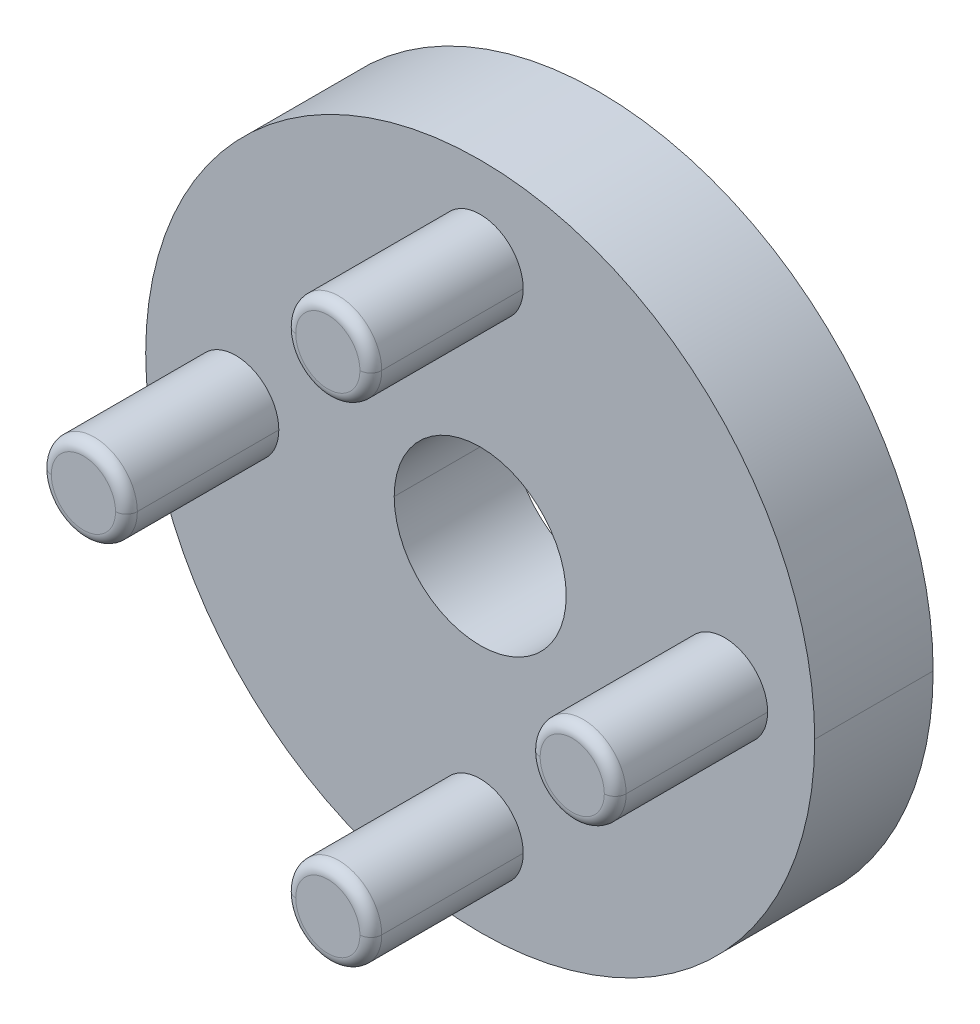
ISO-10303-21;
HEADER;
FILE_DESCRIPTION(('STEP AP214'),'2;1');
FILE_NAME('part.step','',(''),(''),'','','');
FILE_SCHEMA(('AUTOMOTIVE_DESIGN { 1 0 10303 214 1 1 1 1 }'));
ENDSEC;
DATA;
#1=APPLICATION_CONTEXT('core data for automotive mechanical design processes');
#2=APPLICATION_PROTOCOL_DEFINITION('international standard','automotive_design',2000,#1);
#3=PRODUCT_CONTEXT('',#1,'mechanical');
#4=PRODUCT('Part','Part','',(#3));
#5=PRODUCT_RELATED_PRODUCT_CATEGORY('part','',(#4));
#6=PRODUCT_DEFINITION_FORMATION('','',#4);
#7=PRODUCT_DEFINITION_CONTEXT('part definition',#1,'design');
#8=PRODUCT_DEFINITION('design','',#6,#7);
#9=PRODUCT_DEFINITION_SHAPE('','',#8);
#10=(LENGTH_UNIT() NAMED_UNIT(*) SI_UNIT(.MILLI.,.METRE.));
#11=(NAMED_UNIT(*) PLANE_ANGLE_UNIT() SI_UNIT($,.RADIAN.));
#12=(NAMED_UNIT(*) SI_UNIT($,.STERADIAN.) SOLID_ANGLE_UNIT());
#13=UNCERTAINTY_MEASURE_WITH_UNIT(LENGTH_MEASURE(1.E-05),#10,'distance_accuracy_value','');
#14=(GEOMETRIC_REPRESENTATION_CONTEXT(3) GLOBAL_UNCERTAINTY_ASSIGNED_CONTEXT((#13)) GLOBAL_UNIT_ASSIGNED_CONTEXT((#10,
#11,#12)) REPRESENTATION_CONTEXT('',''));
#15=CARTESIAN_POINT('',(0.,0.,0.));
#16=DIRECTION('',(0.,0.,1.));
#17=DIRECTION('',(1.,0.,0.));
#18=AXIS2_PLACEMENT_3D('',#15,#16,#17);
#19=CARTESIAN_POINT('',(-11.3665,1.19057767913881E-13,12.086599906));
#20=DIRECTION('',(0.,0.,1.));
#21=DIRECTION('',(1.,0.,0.));
#22=AXIS2_PLACEMENT_3D('',#19,#20,#21);
#23=TOROIDAL_SURFACE('',#22,1.49225,0.508);
#24=CARTESIAN_POINT('',(-12.85875,1.19240515832484E-13,12.086599906));
#25=DIRECTION('',(0.,1.,0.));
#26=DIRECTION('',(-1.,0.,0.));
#27=AXIS2_PLACEMENT_3D('',#24,#25,#26);
#28=CIRCLE('',#27,0.508);
#29=CARTESIAN_POINT('',(-13.36675,1.19057767913881E-13,12.086599906));
#30=VERTEX_POINT('',#29);
#31=CARTESIAN_POINT('',(-12.85875,1.19271621861183E-13,12.594599906));
#32=VERTEX_POINT('',#31);
#33=EDGE_CURVE('E146',#30,#32,#28,.T.);
#34=ORIENTED_EDGE('',*,*,#33,.F.);
#35=CARTESIAN_POINT('',(-11.3665,1.19057767913881E-13,12.086599906));
#36=DIRECTION('',(0.,0.,-1.));
#37=DIRECTION('',(1.,0.,0.));
#38=AXIS2_PLACEMENT_3D('',#35,#36,#37);
#39=CIRCLE('',#38,2.00025);
#40=CARTESIAN_POINT('',(-9.36625,1.19302727889881E-13,12.086599906));
#41=VERTEX_POINT('',#40);
#42=EDGE_CURVE('E27',#41,#30,#39,.T.);
#43=ORIENTED_EDGE('',*,*,#42,.F.);
#44=CARTESIAN_POINT('',(-9.87425,1.19057767913881E-13,12.086599906));
#45=DIRECTION('',(0.,-1.,0.));
#46=DIRECTION('',(0.,0.,-1.));
#47=AXIS2_PLACEMENT_3D('',#44,#45,#46);
#48=CIRCLE('',#47,0.508);
#49=CARTESIAN_POINT('',(-9.87425,1.19057767913881E-13,12.594599906));
#50=VERTEX_POINT('',#49);
#51=EDGE_CURVE('E154',#41,#50,#48,.T.);
#52=ORIENTED_EDGE('',*,*,#51,.T.);
#53=CARTESIAN_POINT('',(-11.3665,1.19057767913881E-13,12.594599906));
#54=DIRECTION('',(0.,0.,1.));
#55=DIRECTION('',(1.,0.,0.));
#56=AXIS2_PLACEMENT_3D('',#53,#54,#55);
#57=CIRCLE('',#56,1.49225);
#58=EDGE_CURVE('E11',#32,#50,#57,.T.);
#59=ORIENTED_EDGE('',*,*,#58,.F.);
#60=EDGE_LOOP('',(#34,#43,#52,#59));
#61=FACE_BOUND('',#60,.T.);
#62=ADVANCED_FACE('F16',(#61),#23,.T.);
#63=CARTESIAN_POINT('',(0.,-11.3665,12.086599906));
#64=DIRECTION('',(0.,0.,1.));
#65=DIRECTION('',(1.,0.,0.));
#66=AXIS2_PLACEMENT_3D('',#63,#64,#65);
#67=TOROIDAL_SURFACE('',#66,1.49225,0.508);
#68=CARTESIAN_POINT('',(-1.49225,-11.3665,12.086599906));
#69=DIRECTION('',(0.,1.,0.));
#70=DIRECTION('',(-1.,0.,0.));
#71=AXIS2_PLACEMENT_3D('',#68,#69,#70);
#72=CIRCLE('',#71,0.508);
#73=CARTESIAN_POINT('',(-2.00025,-11.3665,12.086599906));
#74=VERTEX_POINT('',#73);
#75=CARTESIAN_POINT('',(-1.49225,-11.3665,12.594599906));
#76=VERTEX_POINT('',#75);
#77=EDGE_CURVE('E265',#74,#76,#72,.T.);
#78=ORIENTED_EDGE('',*,*,#77,.F.);
#79=CARTESIAN_POINT('',(0.,-11.3665,12.086599906));
#80=DIRECTION('',(0.,0.,-1.));
#81=DIRECTION('',(1.,0.,0.));
#82=AXIS2_PLACEMENT_3D('',#79,#80,#81);
#83=CIRCLE('',#82,2.00025);
#84=CARTESIAN_POINT('',(2.00025,-11.3665,12.086599906));
#85=VERTEX_POINT('',#84);
#86=EDGE_CURVE('E230',#85,#74,#83,.T.);
#87=ORIENTED_EDGE('',*,*,#86,.F.);
#88=CARTESIAN_POINT('',(1.49225,-11.3665,12.086599906));
#89=DIRECTION('',(0.,-1.,0.));
#90=DIRECTION('',(0.,0.,-1.));
#91=AXIS2_PLACEMENT_3D('',#88,#89,#90);
#92=CIRCLE('',#91,0.508);
#93=CARTESIAN_POINT('',(1.49225,-11.3665,12.594599906));
#94=VERTEX_POINT('',#93);
#95=EDGE_CURVE('E264',#85,#94,#92,.T.);
#96=ORIENTED_EDGE('',*,*,#95,.T.);
#97=CARTESIAN_POINT('',(0.,-11.3665,12.594599906));
#98=DIRECTION('',(0.,0.,1.));
#99=DIRECTION('',(1.,0.,0.));
#100=AXIS2_PLACEMENT_3D('',#97,#98,#99);
#101=CIRCLE('',#100,1.49225);
#102=EDGE_CURVE('E133',#76,#94,#101,.T.);
#103=ORIENTED_EDGE('',*,*,#102,.F.);
#104=EDGE_LOOP('',(#78,#87,#96,#103));
#105=FACE_BOUND('',#104,.T.);
#106=ADVANCED_FACE('F407',(#105),#67,.T.);
#107=CARTESIAN_POINT('',(11.3665,0.,12.086599906));
#108=DIRECTION('',(0.,0.,1.));
#109=DIRECTION('',(1.,0.,0.));
#110=AXIS2_PLACEMENT_3D('',#107,#108,#109);
#111=TOROIDAL_SURFACE('',#110,1.49225,0.508);
#112=CARTESIAN_POINT('',(9.87425,0.,12.086599906));
#113=DIRECTION('',(0.,1.,0.));
#114=DIRECTION('',(-1.,0.,0.));
#115=AXIS2_PLACEMENT_3D('',#112,#113,#114);
#116=CIRCLE('',#115,0.508);
#117=CARTESIAN_POINT('',(9.36625,0.,12.086599906));
#118=VERTEX_POINT('',#117);
#119=CARTESIAN_POINT('',(9.87425,0.,12.594599906));
#120=VERTEX_POINT('',#119);
#121=EDGE_CURVE('E164',#118,#120,#116,.T.);
#122=ORIENTED_EDGE('',*,*,#121,.F.);
#123=CARTESIAN_POINT('',(11.3665,0.,12.086599906));
#124=DIRECTION('',(0.,0.,-1.));
#125=DIRECTION('',(1.,0.,0.));
#126=AXIS2_PLACEMENT_3D('',#123,#124,#125);
#127=CIRCLE('',#126,2.00025);
#128=CARTESIAN_POINT('',(13.36675,0.,12.086599906));
#129=VERTEX_POINT('',#128);
#130=EDGE_CURVE('E245',#129,#118,#127,.T.);
#131=ORIENTED_EDGE('',*,*,#130,.F.);
#132=CARTESIAN_POINT('',(12.85875,0.,12.086599906));
#133=DIRECTION('',(0.,-1.,0.));
#134=DIRECTION('',(0.,0.,-1.));
#135=AXIS2_PLACEMENT_3D('',#132,#133,#134);
#136=CIRCLE('',#135,0.508);
#137=CARTESIAN_POINT('',(12.85875,0.,12.594599906));
#138=VERTEX_POINT('',#137);
#139=EDGE_CURVE('E210',#129,#138,#136,.T.);
#140=ORIENTED_EDGE('',*,*,#139,.T.);
#141=CARTESIAN_POINT('',(11.3665,0.,12.594599906));
#142=DIRECTION('',(0.,0.,1.));
#143=DIRECTION('',(1.,0.,0.));
#144=AXIS2_PLACEMENT_3D('',#141,#142,#143);
#145=CIRCLE('',#144,1.49225);
#146=EDGE_CURVE('E20',#120,#138,#145,.T.);
#147=ORIENTED_EDGE('',*,*,#146,.F.);
#148=EDGE_LOOP('',(#122,#131,#140,#147));
#149=FACE_BOUND('',#148,.T.);
#150=ADVANCED_FACE('F398',(#149),#111,.T.);
#151=CARTESIAN_POINT('',(-11.3665,1.19057767913881E-13,12.594599906));
#152=DIRECTION('',(0.,0.,1.));
#153=DIRECTION('',(1.,0.,0.));
#154=AXIS2_PLACEMENT_3D('',#151,#152,#153);
#155=PLANE('',#154);
#156=CARTESIAN_POINT('',(-11.3665,1.19057767913881E-13,12.594599906));
#157=DIRECTION('',(0.,0.,1.));
#158=DIRECTION('',(1.,0.,0.));
#159=AXIS2_PLACEMENT_3D('',#156,#157,#158);
#160=CIRCLE('',#159,1.49225);
#161=EDGE_CURVE('E151',#50,#32,#160,.T.);
#162=ORIENTED_EDGE('',*,*,#161,.T.);
#163=ORIENTED_EDGE('',*,*,#58,.T.);
#164=EDGE_LOOP('',(#162,#163));
#165=FACE_BOUND('',#164,.T.);
#166=ADVANCED_FACE('F396',(#165),#155,.T.);
#167=CARTESIAN_POINT('',(-11.3665,1.19057767913881E-13,12.594599906));
#168=DIRECTION('',(0.,0.,-1.));
#169=DIRECTION('',(-1.,0.,0.));
#170=AXIS2_PLACEMENT_3D('',#167,#168,#169);
#171=CYLINDRICAL_SURFACE('',#170,2.00025);
#172=DIRECTION('',(0.,0.,-1.));
#173=VECTOR('',#172,1.);
#174=CARTESIAN_POINT('',(-9.36625,1.19302727889881E-13,12.594599906));
#175=LINE('',#174,#173);
#176=CARTESIAN_POINT('',(-9.36625,1.19302727889881E-13,5.507999906));
#177=VERTEX_POINT('',#176);
#178=EDGE_CURVE('E127',#41,#177,#175,.T.);
#179=ORIENTED_EDGE('',*,*,#178,.F.);
#180=ORIENTED_EDGE('',*,*,#42,.T.);
#181=DIRECTION('',(0.,0.,-1.));
#182=VECTOR('',#181,1.);
#183=CARTESIAN_POINT('',(-13.36675,1.19057767913881E-13,12.594599906));
#184=LINE('',#183,#182);
#185=CARTESIAN_POINT('',(-13.36675,1.19057767913881E-13,5.507999906));
#186=VERTEX_POINT('',#185);
#187=EDGE_CURVE('E124',#30,#186,#184,.T.);
#188=ORIENTED_EDGE('',*,*,#187,.T.);
#189=CARTESIAN_POINT('',(-11.3665,1.19057767913881E-13,5.507999906));
#190=DIRECTION('',(0.,0.,1.));
#191=DIRECTION('',(0.,1.,0.));
#192=AXIS2_PLACEMENT_3D('',#189,#190,#191);
#193=CIRCLE('',#192,2.00025);
#194=EDGE_CURVE('E199',#186,#177,#193,.T.);
#195=ORIENTED_EDGE('',*,*,#194,.T.);
#196=EDGE_LOOP('',(#179,#180,#188,#195));
#197=FACE_BOUND('',#196,.T.);
#198=ADVANCED_FACE('F122',(#197),#171,.T.);
#199=CARTESIAN_POINT('',(0.,-11.3665,12.594599906));
#200=DIRECTION('',(0.,0.,1.));
#201=DIRECTION('',(1.,0.,0.));
#202=AXIS2_PLACEMENT_3D('',#199,#200,#201);
#203=PLANE('',#202);
#204=CARTESIAN_POINT('',(0.,-11.3665,12.594599906));
#205=DIRECTION('',(0.,0.,1.));
#206=DIRECTION('',(1.,0.,0.));
#207=AXIS2_PLACEMENT_3D('',#204,#205,#206);
#208=CIRCLE('',#207,1.49225);
#209=EDGE_CURVE('E261',#94,#76,#208,.T.);
#210=ORIENTED_EDGE('',*,*,#209,.T.);
#211=ORIENTED_EDGE('',*,*,#102,.T.);
#212=EDGE_LOOP('',(#210,#211));
#213=FACE_BOUND('',#212,.T.);
#214=ADVANCED_FACE('F405',(#213),#203,.T.);
#215=CARTESIAN_POINT('',(0.,-11.3665,12.594599906));
#216=DIRECTION('',(0.,0.,-1.));
#217=DIRECTION('',(-1.,0.,0.));
#218=AXIS2_PLACEMENT_3D('',#215,#216,#217);
#219=CYLINDRICAL_SURFACE('',#218,2.00025);
#220=DIRECTION('',(0.,0.,-1.));
#221=VECTOR('',#220,1.);
#222=CARTESIAN_POINT('',(2.00025,-11.3665,12.594599906));
#223=LINE('',#222,#221);
#224=CARTESIAN_POINT('',(2.00025,-11.3665,5.507999906));
#225=VERTEX_POINT('',#224);
#226=EDGE_CURVE('E143',#85,#225,#223,.T.);
#227=ORIENTED_EDGE('',*,*,#226,.F.);
#228=ORIENTED_EDGE('',*,*,#86,.T.);
#229=DIRECTION('',(0.,0.,-1.));
#230=VECTOR('',#229,1.);
#231=CARTESIAN_POINT('',(-2.00025,-11.3665,12.594599906));
#232=LINE('',#231,#230);
#233=CARTESIAN_POINT('',(-2.00025,-11.3665,5.507999906));
#234=VERTEX_POINT('',#233);
#235=EDGE_CURVE('E185',#74,#234,#232,.T.);
#236=ORIENTED_EDGE('',*,*,#235,.T.);
#237=CARTESIAN_POINT('',(0.,-11.3665,5.507999906));
#238=DIRECTION('',(0.,0.,1.));
#239=DIRECTION('',(-1.,0.,0.));
#240=AXIS2_PLACEMENT_3D('',#237,#238,#239);
#241=CIRCLE('',#240,2.00025);
#242=EDGE_CURVE('E202',#234,#225,#241,.T.);
#243=ORIENTED_EDGE('',*,*,#242,.T.);
#244=EDGE_LOOP('',(#227,#228,#236,#243));
#245=FACE_BOUND('',#244,.T.);
#246=ADVANCED_FACE('F434',(#245),#219,.T.);
#247=CARTESIAN_POINT('',(11.3665,0.,12.594599906));
#248=DIRECTION('',(0.,0.,1.));
#249=DIRECTION('',(1.,0.,0.));
#250=AXIS2_PLACEMENT_3D('',#247,#248,#249);
#251=PLANE('',#250);
#252=CARTESIAN_POINT('',(11.3665,0.,12.594599906));
#253=DIRECTION('',(0.,0.,1.));
#254=DIRECTION('',(1.,0.,0.));
#255=AXIS2_PLACEMENT_3D('',#252,#253,#254);
#256=CIRCLE('',#255,1.49225);
#257=EDGE_CURVE('E166',#138,#120,#256,.T.);
#258=ORIENTED_EDGE('',*,*,#257,.T.);
#259=ORIENTED_EDGE('',*,*,#146,.T.);
#260=EDGE_LOOP('',(#258,#259));
#261=FACE_BOUND('',#260,.T.);
#262=ADVANCED_FACE('F427',(#261),#251,.T.);
#263=CARTESIAN_POINT('',(11.3665,0.,12.594599906));
#264=DIRECTION('',(0.,0.,-1.));
#265=DIRECTION('',(-1.,0.,0.));
#266=AXIS2_PLACEMENT_3D('',#263,#264,#265);
#267=CYLINDRICAL_SURFACE('',#266,2.00025);
#268=DIRECTION('',(0.,0.,-1.));
#269=VECTOR('',#268,1.);
#270=CARTESIAN_POINT('',(13.36675,0.,12.594599906));
#271=LINE('',#270,#269);
#272=CARTESIAN_POINT('',(13.36675,0.,5.507999906));
#273=VERTEX_POINT('',#272);
#274=EDGE_CURVE('E189',#129,#273,#271,.T.);
#275=ORIENTED_EDGE('',*,*,#274,.F.);
#276=ORIENTED_EDGE('',*,*,#130,.T.);
#277=DIRECTION('',(0.,0.,-1.));
#278=VECTOR('',#277,1.);
#279=CARTESIAN_POINT('',(9.36625,0.,12.594599906));
#280=LINE('',#279,#278);
#281=CARTESIAN_POINT('',(9.36625,0.,5.507999906));
#282=VERTEX_POINT('',#281);
#283=EDGE_CURVE('E214',#118,#282,#280,.T.);
#284=ORIENTED_EDGE('',*,*,#283,.T.);
#285=CARTESIAN_POINT('',(11.3665,0.,5.507999906));
#286=DIRECTION('',(0.,0.,1.));
#287=DIRECTION('',(0.,-1.,0.));
#288=AXIS2_PLACEMENT_3D('',#285,#286,#287);
#289=CIRCLE('',#288,2.00025);
#290=EDGE_CURVE('E217',#282,#273,#289,.T.);
#291=ORIENTED_EDGE('',*,*,#290,.T.);
#292=EDGE_LOOP('',(#275,#276,#284,#291));
#293=FACE_BOUND('',#292,.T.);
#294=ADVANCED_FACE('F362',(#293),#267,.T.);
#295=CARTESIAN_POINT('',(0.,11.3665,12.086599906));
#296=DIRECTION('',(0.,0.,1.));
#297=DIRECTION('',(1.,0.,0.));
#298=AXIS2_PLACEMENT_3D('',#295,#296,#297);
#299=TOROIDAL_SURFACE('',#298,1.49225,0.508);
#300=CARTESIAN_POINT('',(-1.49225,11.3665,12.086599906));
#301=DIRECTION('',(0.,1.,0.));
#302=DIRECTION('',(-1.,0.,0.));
#303=AXIS2_PLACEMENT_3D('',#300,#301,#302);
#304=CIRCLE('',#303,0.508);
#305=CARTESIAN_POINT('',(-2.00025,11.3665,12.086599906));
#306=VERTEX_POINT('',#305);
#307=CARTESIAN_POINT('',(-1.49225,11.3665,12.594599906));
#308=VERTEX_POINT('',#307);
#309=EDGE_CURVE('E175',#306,#308,#304,.T.);
#310=ORIENTED_EDGE('',*,*,#309,.F.);
#311=CARTESIAN_POINT('',(0.,11.3665,12.086599906));
#312=DIRECTION('',(0.,0.,-1.));
#313=DIRECTION('',(1.,0.,0.));
#314=AXIS2_PLACEMENT_3D('',#311,#312,#313);
#315=CIRCLE('',#314,2.00025);
#316=CARTESIAN_POINT('',(2.00025,11.3665,12.086599906));
#317=VERTEX_POINT('',#316);
#318=EDGE_CURVE('E237',#317,#306,#315,.T.);
#319=ORIENTED_EDGE('',*,*,#318,.F.);
#320=CARTESIAN_POINT('',(1.49225,11.3665,12.086599906));
#321=DIRECTION('',(0.,-1.,0.));
#322=DIRECTION('',(0.,0.,-1.));
#323=AXIS2_PLACEMENT_3D('',#320,#321,#322);
#324=CIRCLE('',#323,0.508);
#325=CARTESIAN_POINT('',(1.49225,11.3665,12.594599906));
#326=VERTEX_POINT('',#325);
#327=EDGE_CURVE('E174',#317,#326,#324,.T.);
#328=ORIENTED_EDGE('',*,*,#327,.T.);
#329=CARTESIAN_POINT('',(0.,11.3665,12.594599906));
#330=DIRECTION('',(0.,0.,1.));
#331=DIRECTION('',(1.,0.,0.));
#332=AXIS2_PLACEMENT_3D('',#329,#330,#331);
#333=CIRCLE('',#332,1.49225);
#334=EDGE_CURVE('E249',#308,#326,#333,.T.);
#335=ORIENTED_EDGE('',*,*,#334,.F.);
#336=EDGE_LOOP('',(#310,#319,#328,#335));
#337=FACE_BOUND('',#336,.T.);
#338=ADVANCED_FACE('F426',(#337),#299,.T.);
#339=CARTESIAN_POINT('',(0.,11.3665,12.594599906));
#340=DIRECTION('',(0.,0.,1.));
#341=DIRECTION('',(1.,0.,0.));
#342=AXIS2_PLACEMENT_3D('',#339,#340,#341);
#343=PLANE('',#342);
#344=CARTESIAN_POINT('',(0.,11.3665,12.594599906));
#345=DIRECTION('',(0.,0.,1.));
#346=DIRECTION('',(1.,0.,0.));
#347=AXIS2_PLACEMENT_3D('',#344,#345,#346);
#348=CIRCLE('',#347,1.49225);
#349=EDGE_CURVE('E179',#326,#308,#348,.T.);
#350=ORIENTED_EDGE('',*,*,#349,.T.);
#351=ORIENTED_EDGE('',*,*,#334,.T.);
#352=EDGE_LOOP('',(#350,#351));
#353=FACE_BOUND('',#352,.T.);
#354=ADVANCED_FACE('F423',(#353),#343,.T.);
#355=CARTESIAN_POINT('',(0.,11.3665,12.594599906));
#356=DIRECTION('',(0.,0.,-1.));
#357=DIRECTION('',(-1.,0.,0.));
#358=AXIS2_PLACEMENT_3D('',#355,#356,#357);
#359=CYLINDRICAL_SURFACE('',#358,2.00025);
#360=DIRECTION('',(0.,0.,-1.));
#361=VECTOR('',#360,1.);
#362=CARTESIAN_POINT('',(2.00025,11.3665,12.594599906));
#363=LINE('',#362,#361);
#364=CARTESIAN_POINT('',(2.00025,11.3665,5.507999906));
#365=VERTEX_POINT('',#364);
#366=EDGE_CURVE('E169',#317,#365,#363,.T.);
#367=ORIENTED_EDGE('',*,*,#366,.F.);
#368=ORIENTED_EDGE('',*,*,#318,.T.);
#369=DIRECTION('',(0.,0.,-1.));
#370=VECTOR('',#369,1.);
#371=CARTESIAN_POINT('',(-2.00025,11.3665,12.594599906));
#372=LINE('',#371,#370);
#373=CARTESIAN_POINT('',(-2.00025,11.3665,5.507999906));
#374=VERTEX_POINT('',#373);
#375=EDGE_CURVE('E194',#306,#374,#372,.T.);
#376=ORIENTED_EDGE('',*,*,#375,.T.);
#377=CARTESIAN_POINT('',(0.,11.3665,5.507999906));
#378=DIRECTION('',(0.,0.,1.));
#379=DIRECTION('',(1.,0.,0.));
#380=AXIS2_PLACEMENT_3D('',#377,#378,#379);
#381=CIRCLE('',#380,2.00025);
#382=EDGE_CURVE('E234',#374,#365,#381,.T.);
#383=ORIENTED_EDGE('',*,*,#382,.T.);
#384=EDGE_LOOP('',(#367,#368,#376,#383));
#385=FACE_BOUND('',#384,.T.);
#386=ADVANCED_FACE('F420',(#385),#359,.T.);
#387=CARTESIAN_POINT('',(0.,0.,0.));
#388=DIRECTION('',(0.,0.,1.));
#389=DIRECTION('',(1.,0.,0.));
#390=AXIS2_PLACEMENT_3D('',#387,#388,#389);
#391=PLANE('',#390);
#392=CARTESIAN_POINT('',(0.,0.,0.));
#393=DIRECTION('',(0.,0.,1.));
#394=DIRECTION('',(1.,0.,0.));
#395=AXIS2_PLACEMENT_3D('',#392,#393,#394);
#396=CIRCLE('',#395,4.);
#397=CARTESIAN_POINT('',(-4.,0.,0.));
#398=VERTEX_POINT('',#397);
#399=CARTESIAN_POINT('',(4.,0.,0.));
#400=VERTEX_POINT('',#399);
#401=EDGE_CURVE('E229',#398,#400,#396,.T.);
#402=ORIENTED_EDGE('',*,*,#401,.T.);
#403=CARTESIAN_POINT('',(0.,0.,0.));
#404=DIRECTION('',(0.,0.,1.));
#405=DIRECTION('',(1.,0.,0.));
#406=AXIS2_PLACEMENT_3D('',#403,#404,#405);
#407=CIRCLE('',#406,4.);
#408=EDGE_CURVE('E203',#400,#398,#407,.T.);
#409=ORIENTED_EDGE('',*,*,#408,.T.);
#410=EDGE_LOOP('',(#402,#409));
#411=FACE_BOUND('',#410,.T.);
#412=CARTESIAN_POINT('',(0.,0.,0.));
#413=DIRECTION('',(0.,0.,1.));
#414=DIRECTION('',(1.,0.,0.));
#415=AXIS2_PLACEMENT_3D('',#412,#413,#414);
#416=CIRCLE('',#415,15.5575);
#417=CARTESIAN_POINT('',(-15.5575,0.,0.));
#418=VERTEX_POINT('',#417);
#419=CARTESIAN_POINT('',(15.5575,0.,0.));
#420=VERTEX_POINT('',#419);
#421=EDGE_CURVE('E41',#418,#420,#416,.T.);
#422=ORIENTED_EDGE('',*,*,#421,.F.);
#423=CARTESIAN_POINT('',(0.,0.,0.));
#424=DIRECTION('',(0.,0.,1.));
#425=DIRECTION('',(1.,0.,0.));
#426=AXIS2_PLACEMENT_3D('',#423,#424,#425);
#427=CIRCLE('',#426,15.5575);
#428=EDGE_CURVE('E239',#420,#418,#427,.T.);
#429=ORIENTED_EDGE('',*,*,#428,.F.);
#430=EDGE_LOOP('',(#422,#429));
#431=FACE_BOUND('',#430,.T.);
#432=ADVANCED_FACE('F422',(#411,#431),#391,.F.);
#433=CARTESIAN_POINT('',(0.,0.,5.507999906));
#434=DIRECTION('',(0.,0.,1.));
#435=DIRECTION('',(1.,0.,0.));
#436=AXIS2_PLACEMENT_3D('',#433,#434,#435);
#437=PLANE('',#436);
#438=CARTESIAN_POINT('',(0.,0.,5.507999906));
#439=DIRECTION('',(0.,0.,1.));
#440=DIRECTION('',(1.,0.,0.));
#441=AXIS2_PLACEMENT_3D('',#438,#439,#440);
#442=CIRCLE('',#441,4.);
#443=CARTESIAN_POINT('',(-4.,0.,5.507999906));
#444=VERTEX_POINT('',#443);
#445=CARTESIAN_POINT('',(4.,0.,5.507999906));
#446=VERTEX_POINT('',#445);
#447=EDGE_CURVE('E198',#444,#446,#442,.T.);
#448=ORIENTED_EDGE('',*,*,#447,.F.);
#449=CARTESIAN_POINT('',(0.,0.,5.507999906));
#450=DIRECTION('',(0.,0.,1.));
#451=DIRECTION('',(1.,0.,0.));
#452=AXIS2_PLACEMENT_3D('',#449,#450,#451);
#453=CIRCLE('',#452,4.);
#454=EDGE_CURVE('E183',#446,#444,#453,.T.);
#455=ORIENTED_EDGE('',*,*,#454,.F.);
#456=EDGE_LOOP('',(#448,#455));
#457=FACE_BOUND('',#456,.T.);
#458=ORIENTED_EDGE('',*,*,#382,.F.);
#459=CARTESIAN_POINT('',(0.,11.3665,5.507999906));
#460=DIRECTION('',(0.,0.,1.));
#461=DIRECTION('',(1.,0.,0.));
#462=AXIS2_PLACEMENT_3D('',#459,#460,#461);
#463=CIRCLE('',#462,2.00025);
#464=EDGE_CURVE('E173',#365,#374,#463,.T.);
#465=ORIENTED_EDGE('',*,*,#464,.F.);
#466=EDGE_LOOP('',(#458,#465));
#467=FACE_BOUND('',#466,.T.);
#468=ORIENTED_EDGE('',*,*,#290,.F.);
#469=CARTESIAN_POINT('',(11.3665,0.,5.507999906));
#470=DIRECTION('',(0.,0.,1.));
#471=DIRECTION('',(0.,-1.,0.));
#472=AXIS2_PLACEMENT_3D('',#469,#470,#471);
#473=CIRCLE('',#472,2.00025);
#474=EDGE_CURVE('E221',#273,#282,#473,.T.);
#475=ORIENTED_EDGE('',*,*,#474,.F.);
#476=EDGE_LOOP('',(#468,#475));
#477=FACE_BOUND('',#476,.T.);
#478=ORIENTED_EDGE('',*,*,#242,.F.);
#479=CARTESIAN_POINT('',(0.,-11.3665,5.507999906));
#480=DIRECTION('',(0.,0.,1.));
#481=DIRECTION('',(-1.,0.,0.));
#482=AXIS2_PLACEMENT_3D('',#479,#480,#481);
#483=CIRCLE('',#482,2.00025);
#484=EDGE_CURVE('E190',#225,#234,#483,.T.);
#485=ORIENTED_EDGE('',*,*,#484,.F.);
#486=EDGE_LOOP('',(#478,#485));
#487=FACE_BOUND('',#486,.T.);
#488=ORIENTED_EDGE('',*,*,#194,.F.);
#489=CARTESIAN_POINT('',(-11.3665,1.19057767913881E-13,5.507999906));
#490=DIRECTION('',(0.,0.,1.));
#491=DIRECTION('',(0.,1.,0.));
#492=AXIS2_PLACEMENT_3D('',#489,#490,#491);
#493=CIRCLE('',#492,2.00025);
#494=EDGE_CURVE('E141',#177,#186,#493,.T.);
#495=ORIENTED_EDGE('',*,*,#494,.F.);
#496=EDGE_LOOP('',(#488,#495));
#497=FACE_BOUND('',#496,.T.);
#498=CARTESIAN_POINT('',(0.,0.,5.507999906));
#499=DIRECTION('',(0.,0.,1.));
#500=DIRECTION('',(1.,0.,0.));
#501=AXIS2_PLACEMENT_3D('',#498,#499,#500);
#502=CIRCLE('',#501,15.5575);
#503=CARTESIAN_POINT('',(-15.5575,0.,5.507999906));
#504=VERTEX_POINT('',#503);
#505=CARTESIAN_POINT('',(15.5575,0.,5.507999906));
#506=VERTEX_POINT('',#505);
#507=EDGE_CURVE('E184',#504,#506,#502,.T.);
#508=ORIENTED_EDGE('',*,*,#507,.T.);
#509=CARTESIAN_POINT('',(0.,0.,5.507999906));
#510=DIRECTION('',(0.,0.,1.));
#511=DIRECTION('',(1.,0.,0.));
#512=AXIS2_PLACEMENT_3D('',#509,#510,#511);
#513=CIRCLE('',#512,15.5575);
#514=EDGE_CURVE('E287',#506,#504,#513,.T.);
#515=ORIENTED_EDGE('',*,*,#514,.T.);
#516=EDGE_LOOP('',(#508,#515));
#517=FACE_BOUND('',#516,.T.);
#518=ADVANCED_FACE('F317',(#457,#467,#477,#487,#497,#517),#437,.T.);
#519=CARTESIAN_POINT('',(0.,0.,5.507999906));
#520=DIRECTION('',(0.,0.,-1.));
#521=DIRECTION('',(-1.,0.,0.));
#522=AXIS2_PLACEMENT_3D('',#519,#520,#521);
#523=CYLINDRICAL_SURFACE('',#522,4.);
#524=DIRECTION('',(0.,0.,-1.));
#525=VECTOR('',#524,1.);
#526=CARTESIAN_POINT('',(4.,0.,5.507999906));
#527=LINE('',#526,#525);
#528=EDGE_CURVE('E225',#446,#400,#527,.T.);
#529=ORIENTED_EDGE('',*,*,#528,.F.);
#530=ORIENTED_EDGE('',*,*,#454,.T.);
#531=DIRECTION('',(0.,0.,-1.));
#532=VECTOR('',#531,1.);
#533=CARTESIAN_POINT('',(-4.,0.,5.507999906));
#534=LINE('',#533,#532);
#535=EDGE_CURVE('E273',#444,#398,#534,.T.);
#536=ORIENTED_EDGE('',*,*,#535,.T.);
#537=ORIENTED_EDGE('',*,*,#408,.F.);
#538=EDGE_LOOP('',(#529,#530,#536,#537));
#539=FACE_BOUND('',#538,.T.);
#540=ADVANCED_FACE('F18',(#539),#523,.F.);
#541=CARTESIAN_POINT('',(0.,0.,5.507999906));
#542=DIRECTION('',(0.,0.,-1.));
#543=DIRECTION('',(-1.,0.,0.));
#544=AXIS2_PLACEMENT_3D('',#541,#542,#543);
#545=CYLINDRICAL_SURFACE('',#544,15.5575);
#546=DIRECTION('',(0.,0.,-1.));
#547=VECTOR('',#546,1.);
#548=CARTESIAN_POINT('',(15.5575,0.,5.507999906));
#549=LINE('',#548,#547);
#550=EDGE_CURVE('E244',#506,#420,#549,.T.);
#551=ORIENTED_EDGE('',*,*,#550,.F.);
#552=ORIENTED_EDGE('',*,*,#507,.F.);
#553=DIRECTION('',(0.,0.,-1.));
#554=VECTOR('',#553,1.);
#555=CARTESIAN_POINT('',(-15.5575,0.,5.507999906));
#556=LINE('',#555,#554);
#557=EDGE_CURVE('E243',#504,#418,#556,.T.);
#558=ORIENTED_EDGE('',*,*,#557,.T.);
#559=ORIENTED_EDGE('',*,*,#421,.T.);
#560=EDGE_LOOP('',(#551,#552,#558,#559));
#561=FACE_BOUND('',#560,.T.);
#562=ADVANCED_FACE('F443',(#561),#545,.T.);
#563=CARTESIAN_POINT('',(0.,0.,5.507999906));
#564=DIRECTION('',(0.,0.,-1.));
#565=DIRECTION('',(-1.,0.,0.));
#566=AXIS2_PLACEMENT_3D('',#563,#564,#565);
#567=CYLINDRICAL_SURFACE('',#566,15.5575);
#568=ORIENTED_EDGE('',*,*,#514,.F.);
#569=ORIENTED_EDGE('',*,*,#550,.T.);
#570=ORIENTED_EDGE('',*,*,#428,.T.);
#571=ORIENTED_EDGE('',*,*,#557,.F.);
#572=EDGE_LOOP('',(#568,#569,#570,#571));
#573=FACE_BOUND('',#572,.T.);
#574=ADVANCED_FACE('F445',(#573),#567,.T.);
#575=CARTESIAN_POINT('',(0.,0.,5.507999906));
#576=DIRECTION('',(0.,0.,-1.));
#577=DIRECTION('',(-1.,0.,0.));
#578=AXIS2_PLACEMENT_3D('',#575,#576,#577);
#579=CYLINDRICAL_SURFACE('',#578,4.);
#580=ORIENTED_EDGE('',*,*,#447,.T.);
#581=ORIENTED_EDGE('',*,*,#528,.T.);
#582=ORIENTED_EDGE('',*,*,#401,.F.);
#583=ORIENTED_EDGE('',*,*,#535,.F.);
#584=EDGE_LOOP('',(#580,#581,#582,#583));
#585=FACE_BOUND('',#584,.T.);
#586=ADVANCED_FACE('F313',(#585),#579,.F.);
#587=CARTESIAN_POINT('',(0.,11.3665,12.594599906));
#588=DIRECTION('',(0.,0.,-1.));
#589=DIRECTION('',(-1.,0.,0.));
#590=AXIS2_PLACEMENT_3D('',#587,#588,#589);
#591=CYLINDRICAL_SURFACE('',#590,2.00025);
#592=CARTESIAN_POINT('',(0.,11.3665,12.086599906));
#593=DIRECTION('',(0.,0.,-1.));
#594=DIRECTION('',(1.,0.,0.));
#595=AXIS2_PLACEMENT_3D('',#592,#593,#594);
#596=CIRCLE('',#595,2.00025);
#597=EDGE_CURVE('E180',#306,#317,#596,.T.);
#598=ORIENTED_EDGE('',*,*,#597,.T.);
#599=ORIENTED_EDGE('',*,*,#366,.T.);
#600=ORIENTED_EDGE('',*,*,#464,.T.);
#601=ORIENTED_EDGE('',*,*,#375,.F.);
#602=EDGE_LOOP('',(#598,#599,#600,#601));
#603=FACE_BOUND('',#602,.T.);
#604=ADVANCED_FACE('F461',(#603),#591,.T.);
#605=CARTESIAN_POINT('',(0.,11.3665,12.086599906));
#606=DIRECTION('',(0.,0.,1.));
#607=DIRECTION('',(1.,0.,0.));
#608=AXIS2_PLACEMENT_3D('',#605,#606,#607);
#609=TOROIDAL_SURFACE('',#608,1.49225,0.508);
#610=ORIENTED_EDGE('',*,*,#597,.F.);
#611=ORIENTED_EDGE('',*,*,#309,.T.);
#612=ORIENTED_EDGE('',*,*,#349,.F.);
#613=ORIENTED_EDGE('',*,*,#327,.F.);
#614=EDGE_LOOP('',(#610,#611,#612,#613));
#615=FACE_BOUND('',#614,.T.);
#616=ADVANCED_FACE('F458',(#615),#609,.T.);
#617=CARTESIAN_POINT('',(11.3665,0.,12.594599906));
#618=DIRECTION('',(0.,0.,-1.));
#619=DIRECTION('',(-1.,0.,0.));
#620=AXIS2_PLACEMENT_3D('',#617,#618,#619);
#621=CYLINDRICAL_SURFACE('',#620,2.00025);
#622=CARTESIAN_POINT('',(11.3665,0.,12.086599906));
#623=DIRECTION('',(0.,0.,-1.));
#624=DIRECTION('',(1.,0.,0.));
#625=AXIS2_PLACEMENT_3D('',#622,#623,#624);
#626=CIRCLE('',#625,2.00025);
#627=EDGE_CURVE('E167',#118,#129,#626,.T.);
#628=ORIENTED_EDGE('',*,*,#627,.T.);
#629=ORIENTED_EDGE('',*,*,#274,.T.);
#630=ORIENTED_EDGE('',*,*,#474,.T.);
#631=ORIENTED_EDGE('',*,*,#283,.F.);
#632=EDGE_LOOP('',(#628,#629,#630,#631));
#633=FACE_BOUND('',#632,.T.);
#634=ADVANCED_FACE('F369',(#633),#621,.T.);
#635=CARTESIAN_POINT('',(0.,-11.3665,12.594599906));
#636=DIRECTION('',(0.,0.,-1.));
#637=DIRECTION('',(-1.,0.,0.));
#638=AXIS2_PLACEMENT_3D('',#635,#636,#637);
#639=CYLINDRICAL_SURFACE('',#638,2.00025);
#640=CARTESIAN_POINT('',(0.,-11.3665,12.086599906));
#641=DIRECTION('',(0.,0.,-1.));
#642=DIRECTION('',(1.,0.,0.));
#643=AXIS2_PLACEMENT_3D('',#640,#641,#642);
#644=CIRCLE('',#643,2.00025);
#645=EDGE_CURVE('E277',#74,#85,#644,.T.);
#646=ORIENTED_EDGE('',*,*,#645,.T.);
#647=ORIENTED_EDGE('',*,*,#226,.T.);
#648=ORIENTED_EDGE('',*,*,#484,.T.);
#649=ORIENTED_EDGE('',*,*,#235,.F.);
#650=EDGE_LOOP('',(#646,#647,#648,#649));
#651=FACE_BOUND('',#650,.T.);
#652=ADVANCED_FACE('F455',(#651),#639,.T.);
#653=CARTESIAN_POINT('',(-11.3665,1.19057767913881E-13,12.594599906));
#654=DIRECTION('',(0.,0.,-1.));
#655=DIRECTION('',(-1.,0.,0.));
#656=AXIS2_PLACEMENT_3D('',#653,#654,#655);
#657=CYLINDRICAL_SURFACE('',#656,2.00025);
#658=CARTESIAN_POINT('',(-11.3665,1.19057767913881E-13,12.086599906));
#659=DIRECTION('',(0.,0.,-1.));
#660=DIRECTION('',(1.,0.,0.));
#661=AXIS2_PLACEMENT_3D('',#658,#659,#660);
#662=CIRCLE('',#661,2.00025);
#663=EDGE_CURVE('E139',#30,#41,#662,.T.);
#664=ORIENTED_EDGE('',*,*,#663,.T.);
#665=ORIENTED_EDGE('',*,*,#178,.T.);
#666=ORIENTED_EDGE('',*,*,#494,.T.);
#667=ORIENTED_EDGE('',*,*,#187,.F.);
#668=EDGE_LOOP('',(#664,#665,#666,#667));
#669=FACE_BOUND('',#668,.T.);
#670=ADVANCED_FACE('F137',(#669),#657,.T.);
#671=CARTESIAN_POINT('',(11.3665,0.,12.086599906));
#672=DIRECTION('',(0.,0.,1.));
#673=DIRECTION('',(1.,0.,0.));
#674=AXIS2_PLACEMENT_3D('',#671,#672,#673);
#675=TOROIDAL_SURFACE('',#674,1.49225,0.508);
#676=ORIENTED_EDGE('',*,*,#627,.F.);
#677=ORIENTED_EDGE('',*,*,#121,.T.);
#678=ORIENTED_EDGE('',*,*,#257,.F.);
#679=ORIENTED_EDGE('',*,*,#139,.F.);
#680=EDGE_LOOP('',(#676,#677,#678,#679));
#681=FACE_BOUND('',#680,.T.);
#682=ADVANCED_FACE('F448',(#681),#675,.T.);
#683=CARTESIAN_POINT('',(0.,-11.3665,12.086599906));
#684=DIRECTION('',(0.,0.,1.));
#685=DIRECTION('',(1.,0.,0.));
#686=AXIS2_PLACEMENT_3D('',#683,#684,#685);
#687=TOROIDAL_SURFACE('',#686,1.49225,0.508);
#688=ORIENTED_EDGE('',*,*,#645,.F.);
#689=ORIENTED_EDGE('',*,*,#77,.T.);
#690=ORIENTED_EDGE('',*,*,#209,.F.);
#691=ORIENTED_EDGE('',*,*,#95,.F.);
#692=EDGE_LOOP('',(#688,#689,#690,#691));
#693=FACE_BOUND('',#692,.T.);
#694=ADVANCED_FACE('F451',(#693),#687,.T.);
#695=CARTESIAN_POINT('',(-11.3665,1.19057767913881E-13,12.086599906));
#696=DIRECTION('',(0.,0.,1.));
#697=DIRECTION('',(1.,0.,0.));
#698=AXIS2_PLACEMENT_3D('',#695,#696,#697);
#699=TOROIDAL_SURFACE('',#698,1.49225,0.508);
#700=ORIENTED_EDGE('',*,*,#663,.F.);
#701=ORIENTED_EDGE('',*,*,#33,.T.);
#702=ORIENTED_EDGE('',*,*,#161,.F.);
#703=ORIENTED_EDGE('',*,*,#51,.F.);
#704=EDGE_LOOP('',(#700,#701,#702,#703));
#705=FACE_BOUND('',#704,.T.);
#706=ADVANCED_FACE('F153',(#705),#699,.T.);
#707=CLOSED_SHELL('',(#62,#106,#150,#166,#198,#214,#246,#262,#294,#338,#354,#386,#432,#518,#540,
#562,#574,#586,#604,#616,#634,#652,#670,#682,#694,#706));
#708=MANIFOLD_SOLID_BREP('B1',#707);
#709=ADVANCED_BREP_SHAPE_REPRESENTATION('',(#18,#708),#14);
#710=SHAPE_DEFINITION_REPRESENTATION(#9,#709);
ENDSEC;
END-ISO-10303-21;
